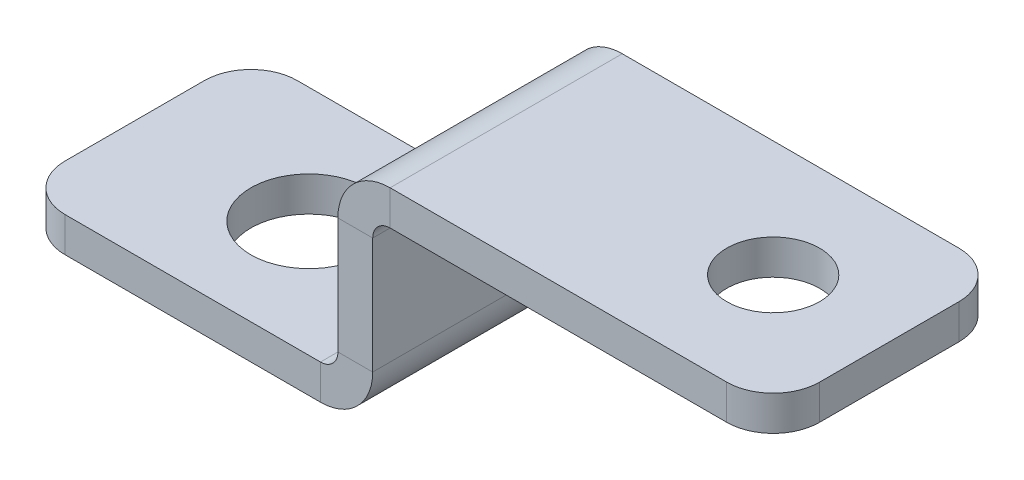
ISO-10303-21;
HEADER;
FILE_DESCRIPTION(('STEP AP214'),'2;1');
FILE_NAME('part.step','',(''),(''),'','','');
FILE_SCHEMA(('AUTOMOTIVE_DESIGN { 1 0 10303 214 1 1 1 1 }'));
ENDSEC;
DATA;
#1=APPLICATION_CONTEXT('core data for automotive mechanical design processes');
#2=APPLICATION_PROTOCOL_DEFINITION('international standard','automotive_design',2000,#1);
#3=PRODUCT_CONTEXT('',#1,'mechanical');
#4=PRODUCT('Part','Part','',(#3));
#5=PRODUCT_RELATED_PRODUCT_CATEGORY('part','',(#4));
#6=PRODUCT_DEFINITION_FORMATION('','',#4);
#7=PRODUCT_DEFINITION_CONTEXT('part definition',#1,'design');
#8=PRODUCT_DEFINITION('design','',#6,#7);
#9=PRODUCT_DEFINITION_SHAPE('','',#8);
#10=(LENGTH_UNIT() NAMED_UNIT(*) SI_UNIT(.MILLI.,.METRE.));
#11=(NAMED_UNIT(*) PLANE_ANGLE_UNIT() SI_UNIT($,.RADIAN.));
#12=(NAMED_UNIT(*) SI_UNIT($,.STERADIAN.) SOLID_ANGLE_UNIT());
#13=UNCERTAINTY_MEASURE_WITH_UNIT(LENGTH_MEASURE(1.E-05),#10,'distance_accuracy_value','');
#14=(GEOMETRIC_REPRESENTATION_CONTEXT(3) GLOBAL_UNCERTAINTY_ASSIGNED_CONTEXT((#13)) GLOBAL_UNIT_ASSIGNED_CONTEXT((#10,
#11,#12)) REPRESENTATION_CONTEXT('',''));
#15=CARTESIAN_POINT('',(0.,0.,0.));
#16=DIRECTION('',(0.,0.,1.));
#17=DIRECTION('',(1.,0.,0.));
#18=AXIS2_PLACEMENT_3D('',#15,#16,#17);
#19=CARTESIAN_POINT('',(13.75,0.75,10.));
#20=DIRECTION('',(0.,0.,1.));
#21=DIRECTION('',(1.,0.,0.));
#22=AXIS2_PLACEMENT_3D('',#19,#20,#21);
#23=PLANE('',#22);
#24=DIRECTION('',(1.,0.,0.));
#25=VECTOR('',#24,1.);
#26=CARTESIAN_POINT('',(13.75,0.75,10.));
#27=LINE('',#26,#25);
#28=CARTESIAN_POINT('',(13.75,0.75,10.));
#29=VERTEX_POINT('',#28);
#30=CARTESIAN_POINT('',(15.25,0.75,10.));
#31=VERTEX_POINT('',#30);
#32=EDGE_CURVE('E318',#29,#31,#27,.T.);
#33=ORIENTED_EDGE('',*,*,#32,.F.);
#34=CARTESIAN_POINT('',(13.,0.75,10.));
#35=DIRECTION('',(0.,0.,-1.));
#36=DIRECTION('',(-1.,0.,0.));
#37=AXIS2_PLACEMENT_3D('',#34,#35,#36);
#38=CIRCLE('',#37,0.75);
#39=CARTESIAN_POINT('',(13.,0.,10.));
#40=VERTEX_POINT('',#39);
#41=EDGE_CURVE('E203',#40,#29,#38,.F.);
#42=ORIENTED_EDGE('',*,*,#41,.F.);
#43=DIRECTION('',(0.,1.,0.));
#44=VECTOR('',#43,1.);
#45=CARTESIAN_POINT('',(13.,-1.5,10.));
#46=LINE('',#45,#44);
#47=CARTESIAN_POINT('',(13.,-1.5,10.));
#48=VERTEX_POINT('',#47);
#49=EDGE_CURVE('E314',#48,#40,#46,.T.);
#50=ORIENTED_EDGE('',*,*,#49,.F.);
#51=CARTESIAN_POINT('',(13.,0.75,10.));
#52=DIRECTION('',(0.,0.,1.));
#53=DIRECTION('',(1.,0.,0.));
#54=AXIS2_PLACEMENT_3D('',#51,#52,#53);
#55=CIRCLE('',#54,2.25);
#56=EDGE_CURVE('E216',#48,#31,#55,.T.);
#57=ORIENTED_EDGE('',*,*,#56,.T.);
#58=EDGE_LOOP('',(#33,#42,#50,#57));
#59=FACE_BOUND('',#58,.T.);
#60=ADVANCED_FACE('F41',(#59),#23,.T.);
#61=CARTESIAN_POINT('',(13.,-1.5,10.));
#62=DIRECTION('',(0.,0.,1.));
#63=DIRECTION('',(1.,0.,0.));
#64=AXIS2_PLACEMENT_3D('',#61,#62,#63);
#65=PLANE('',#64);
#66=DIRECTION('',(0.,1.,0.));
#67=VECTOR('',#66,1.);
#68=CARTESIAN_POINT('',(13.75,0.,10.));
#69=LINE('',#68,#67);
#70=CARTESIAN_POINT('',(13.75,5.75,10.));
#71=VERTEX_POINT('',#70);
#72=EDGE_CURVE('E200',#29,#71,#69,.T.);
#73=ORIENTED_EDGE('',*,*,#72,.F.);
#74=ORIENTED_EDGE('',*,*,#32,.T.);
#75=DIRECTION('',(0.,1.,0.));
#76=VECTOR('',#75,1.);
#77=CARTESIAN_POINT('',(15.25,0.,10.));
#78=LINE('',#77,#76);
#79=CARTESIAN_POINT('',(15.25,5.75,10.));
#80=VERTEX_POINT('',#79);
#81=EDGE_CURVE('E220',#31,#80,#78,.T.);
#82=ORIENTED_EDGE('',*,*,#81,.T.);
#83=DIRECTION('',(-1.,0.,0.));
#84=VECTOR('',#83,1.);
#85=CARTESIAN_POINT('',(15.25,5.75,10.));
#86=LINE('',#85,#84);
#87=EDGE_CURVE('E170',#80,#71,#86,.T.);
#88=ORIENTED_EDGE('',*,*,#87,.T.);
#89=EDGE_LOOP('',(#73,#74,#82,#88));
#90=FACE_BOUND('',#89,.T.);
#91=ADVANCED_FACE('F400',(#90),#65,.T.);
#92=CARTESIAN_POINT('',(13.,0.,0.));
#93=DIRECTION('',(0.,0.,-1.));
#94=DIRECTION('',(-1.,0.,0.));
#95=AXIS2_PLACEMENT_3D('',#92,#93,#94);
#96=PLANE('',#95);
#97=DIRECTION('',(0.,-1.,0.));
#98=VECTOR('',#97,1.);
#99=CARTESIAN_POINT('',(13.,0.,0.));
#100=LINE('',#99,#98);
#101=CARTESIAN_POINT('',(13.,0.,0.));
#102=VERTEX_POINT('',#101);
#103=CARTESIAN_POINT('',(13.,-1.5,0.));
#104=VERTEX_POINT('',#103);
#105=EDGE_CURVE('E310',#102,#104,#100,.T.);
#106=ORIENTED_EDGE('',*,*,#105,.F.);
#107=CARTESIAN_POINT('',(13.,0.75,0.));
#108=DIRECTION('',(0.,0.,-1.));
#109=DIRECTION('',(-1.,0.,0.));
#110=AXIS2_PLACEMENT_3D('',#107,#108,#109);
#111=CIRCLE('',#110,0.75);
#112=CARTESIAN_POINT('',(13.75,0.75,0.));
#113=VERTEX_POINT('',#112);
#114=EDGE_CURVE('E241',#102,#113,#111,.F.);
#115=ORIENTED_EDGE('',*,*,#114,.T.);
#116=DIRECTION('',(-1.,0.,0.));
#117=VECTOR('',#116,1.);
#118=CARTESIAN_POINT('',(15.25,0.75,0.));
#119=LINE('',#118,#117);
#120=CARTESIAN_POINT('',(15.25,0.75,0.));
#121=VERTEX_POINT('',#120);
#122=EDGE_CURVE('E169',#121,#113,#119,.T.);
#123=ORIENTED_EDGE('',*,*,#122,.F.);
#124=CARTESIAN_POINT('',(13.,0.75,0.));
#125=DIRECTION('',(0.,0.,1.));
#126=DIRECTION('',(1.,0.,0.));
#127=AXIS2_PLACEMENT_3D('',#124,#125,#126);
#128=CIRCLE('',#127,2.25);
#129=EDGE_CURVE('E251',#104,#121,#128,.T.);
#130=ORIENTED_EDGE('',*,*,#129,.F.);
#131=EDGE_LOOP('',(#106,#115,#123,#130));
#132=FACE_BOUND('',#131,.T.);
#133=ADVANCED_FACE('F450',(#132),#96,.T.);
#134=CARTESIAN_POINT('',(15.25,0.75,0.));
#135=DIRECTION('',(0.,0.,-1.));
#136=DIRECTION('',(-1.,0.,0.));
#137=AXIS2_PLACEMENT_3D('',#134,#135,#136);
#138=PLANE('',#137);
#139=DIRECTION('',(1.,0.,0.));
#140=VECTOR('',#139,1.);
#141=CARTESIAN_POINT('',(0.,-1.5,0.));
#142=LINE('',#141,#140);
#143=CARTESIAN_POINT('',(2.,-1.5,0.));
#144=VERTEX_POINT('',#143);
#145=EDGE_CURVE('E248',#144,#104,#142,.T.);
#146=ORIENTED_EDGE('',*,*,#145,.F.);
#147=DIRECTION('',(0.,1.,0.));
#148=VECTOR('',#147,1.);
#149=CARTESIAN_POINT('',(2.,0.75,0.));
#150=LINE('',#149,#148);
#151=CARTESIAN_POINT('',(2.,0.,0.));
#152=VERTEX_POINT('',#151);
#153=EDGE_CURVE('E346',#144,#152,#150,.T.);
#154=ORIENTED_EDGE('',*,*,#153,.T.);
#155=DIRECTION('',(1.,0.,0.));
#156=VECTOR('',#155,1.);
#157=CARTESIAN_POINT('',(0.,0.,0.));
#158=LINE('',#157,#156);
#159=EDGE_CURVE('E245',#152,#102,#158,.T.);
#160=ORIENTED_EDGE('',*,*,#159,.T.);
#161=ORIENTED_EDGE('',*,*,#105,.T.);
#162=EDGE_LOOP('',(#146,#154,#160,#161));
#163=FACE_BOUND('',#162,.T.);
#164=ADVANCED_FACE('F373',(#163),#138,.T.);
#165=CARTESIAN_POINT('',(16.,8.,10.));
#166=DIRECTION('',(0.,0.,1.));
#167=DIRECTION('',(1.,0.,0.));
#168=AXIS2_PLACEMENT_3D('',#165,#166,#167);
#169=PLANE('',#168);
#170=DIRECTION('',(0.,-1.,0.));
#171=VECTOR('',#170,1.);
#172=CARTESIAN_POINT('',(16.,8.,10.));
#173=LINE('',#172,#171);
#174=CARTESIAN_POINT('',(16.,8.,10.));
#175=VERTEX_POINT('',#174);
#176=CARTESIAN_POINT('',(16.,6.5,10.));
#177=VERTEX_POINT('',#176);
#178=EDGE_CURVE('E156',#175,#177,#173,.T.);
#179=ORIENTED_EDGE('',*,*,#178,.F.);
#180=CARTESIAN_POINT('',(16.,5.75,10.));
#181=DIRECTION('',(0.,0.,1.));
#182=DIRECTION('',(1.,0.,0.));
#183=AXIS2_PLACEMENT_3D('',#180,#181,#182);
#184=CIRCLE('',#183,2.25);
#185=EDGE_CURVE('E160',#71,#175,#184,.F.);
#186=ORIENTED_EDGE('',*,*,#185,.F.);
#187=ORIENTED_EDGE('',*,*,#87,.F.);
#188=CARTESIAN_POINT('',(16.,5.75,10.));
#189=DIRECTION('',(0.,0.,1.));
#190=DIRECTION('',(1.,0.,0.));
#191=AXIS2_PLACEMENT_3D('',#188,#189,#190);
#192=CIRCLE('',#191,0.75);
#193=EDGE_CURVE('E163',#80,#177,#192,.F.);
#194=ORIENTED_EDGE('',*,*,#193,.T.);
#195=EDGE_LOOP('',(#179,#186,#187,#194));
#196=FACE_BOUND('',#195,.T.);
#197=ADVANCED_FACE('F158',(#196),#169,.T.);
#198=CARTESIAN_POINT('',(15.25,5.75,10.));
#199=DIRECTION('',(0.,0.,1.));
#200=DIRECTION('',(1.,0.,0.));
#201=AXIS2_PLACEMENT_3D('',#198,#199,#200);
#202=PLANE('',#201);
#203=DIRECTION('',(1.,0.,0.));
#204=VECTOR('',#203,1.);
#205=CARTESIAN_POINT('',(13.75,6.5,10.));
#206=LINE('',#205,#204);
#207=CARTESIAN_POINT('',(30.5,6.5,10.));
#208=VERTEX_POINT('',#207);
#209=EDGE_CURVE('E194',#177,#208,#206,.T.);
#210=ORIENTED_EDGE('',*,*,#209,.T.);
#211=DIRECTION('',(0.,-1.,0.));
#212=VECTOR('',#211,1.);
#213=CARTESIAN_POINT('',(30.5,5.75,10.));
#214=LINE('',#213,#212);
#215=CARTESIAN_POINT('',(30.5,8.,10.));
#216=VERTEX_POINT('',#215);
#217=EDGE_CURVE('E192',#208,#216,#214,.F.);
#218=ORIENTED_EDGE('',*,*,#217,.T.);
#219=DIRECTION('',(1.,0.,0.));
#220=VECTOR('',#219,1.);
#221=CARTESIAN_POINT('',(13.75,8.,10.));
#222=LINE('',#221,#220);
#223=EDGE_CURVE('E179',#175,#216,#222,.T.);
#224=ORIENTED_EDGE('',*,*,#223,.F.);
#225=ORIENTED_EDGE('',*,*,#178,.T.);
#226=EDGE_LOOP('',(#210,#218,#224,#225));
#227=FACE_BOUND('',#226,.T.);
#228=ADVANCED_FACE('F190',(#227),#202,.T.);
#229=CARTESIAN_POINT('',(13.75,5.75,0.));
#230=DIRECTION('',(0.,0.,-1.));
#231=DIRECTION('',(-1.,0.,0.));
#232=AXIS2_PLACEMENT_3D('',#229,#230,#231);
#233=PLANE('',#232);
#234=DIRECTION('',(1.,0.,0.));
#235=VECTOR('',#234,1.);
#236=CARTESIAN_POINT('',(13.75,5.75,0.));
#237=LINE('',#236,#235);
#238=CARTESIAN_POINT('',(13.75,5.75,0.));
#239=VERTEX_POINT('',#238);
#240=CARTESIAN_POINT('',(15.25,5.75,0.));
#241=VERTEX_POINT('',#240);
#242=EDGE_CURVE('E303',#239,#241,#237,.T.);
#243=ORIENTED_EDGE('',*,*,#242,.F.);
#244=CARTESIAN_POINT('',(16.,5.75,0.));
#245=DIRECTION('',(0.,0.,1.));
#246=DIRECTION('',(1.,0.,0.));
#247=AXIS2_PLACEMENT_3D('',#244,#245,#246);
#248=CIRCLE('',#247,2.25);
#249=CARTESIAN_POINT('',(16.,8.,0.));
#250=VERTEX_POINT('',#249);
#251=EDGE_CURVE('E234',#239,#250,#248,.F.);
#252=ORIENTED_EDGE('',*,*,#251,.T.);
#253=DIRECTION('',(0.,1.,0.));
#254=VECTOR('',#253,1.);
#255=CARTESIAN_POINT('',(16.,6.5,0.));
#256=LINE('',#255,#254);
#257=CARTESIAN_POINT('',(16.,6.5,0.));
#258=VERTEX_POINT('',#257);
#259=EDGE_CURVE('E300',#258,#250,#256,.T.);
#260=ORIENTED_EDGE('',*,*,#259,.F.);
#261=CARTESIAN_POINT('',(16.,5.75,0.));
#262=DIRECTION('',(0.,0.,1.));
#263=DIRECTION('',(1.,0.,0.));
#264=AXIS2_PLACEMENT_3D('',#261,#262,#263);
#265=CIRCLE('',#264,0.75);
#266=EDGE_CURVE('E259',#241,#258,#265,.F.);
#267=ORIENTED_EDGE('',*,*,#266,.F.);
#268=EDGE_LOOP('',(#243,#252,#260,#267));
#269=FACE_BOUND('',#268,.T.);
#270=ADVANCED_FACE('F579',(#269),#233,.T.);
#271=CARTESIAN_POINT('',(16.,6.5,0.));
#272=DIRECTION('',(0.,0.,-1.));
#273=DIRECTION('',(-1.,0.,0.));
#274=AXIS2_PLACEMENT_3D('',#271,#272,#273);
#275=PLANE('',#274);
#276=DIRECTION('',(0.,1.,0.));
#277=VECTOR('',#276,1.);
#278=CARTESIAN_POINT('',(13.75,0.,0.));
#279=LINE('',#278,#277);
#280=EDGE_CURVE('E237',#113,#239,#279,.T.);
#281=ORIENTED_EDGE('',*,*,#280,.T.);
#282=ORIENTED_EDGE('',*,*,#242,.T.);
#283=DIRECTION('',(0.,1.,0.));
#284=VECTOR('',#283,1.);
#285=CARTESIAN_POINT('',(15.25,0.,0.));
#286=LINE('',#285,#284);
#287=EDGE_CURVE('E255',#121,#241,#286,.T.);
#288=ORIENTED_EDGE('',*,*,#287,.F.);
#289=ORIENTED_EDGE('',*,*,#122,.T.);
#290=EDGE_LOOP('',(#281,#282,#288,#289));
#291=FACE_BOUND('',#290,.T.);
#292=ADVANCED_FACE('F566',(#291),#275,.T.);
#293=CARTESIAN_POINT('',(13.75,6.5,10.));
#294=DIRECTION('',(0.,1.,0.));
#295=DIRECTION('',(0.,0.,1.));
#296=AXIS2_PLACEMENT_3D('',#293,#294,#295);
#297=PLANE('',#296);
#298=CARTESIAN_POINT('',(27.5,6.5,5.));
#299=DIRECTION('',(0.,1.,0.));
#300=DIRECTION('',(0.,0.,1.));
#301=AXIS2_PLACEMENT_3D('',#298,#299,#300);
#302=CIRCLE('',#301,2.);
#303=CARTESIAN_POINT('',(27.5,6.5,7.));
#304=VERTEX_POINT('',#303);
#305=EDGE_CURVE('E420',#304,#304,#302,.T.);
#306=ORIENTED_EDGE('',*,*,#305,.T.);
#307=EDGE_LOOP('',(#306));
#308=FACE_BOUND('',#307,.T.);
#309=DIRECTION('',(1.,0.,0.));
#310=VECTOR('',#309,1.);
#311=CARTESIAN_POINT('',(13.75,6.5,0.));
#312=LINE('',#311,#310);
#313=CARTESIAN_POINT('',(30.5,6.5,0.));
#314=VERTEX_POINT('',#313);
#315=EDGE_CURVE('E227',#258,#314,#312,.T.);
#316=ORIENTED_EDGE('',*,*,#315,.T.);
#317=CARTESIAN_POINT('',(30.5,6.5,2.));
#318=DIRECTION('',(0.,1.,0.));
#319=DIRECTION('',(0.,0.,1.));
#320=AXIS2_PLACEMENT_3D('',#317,#318,#319);
#321=CIRCLE('',#320,2.);
#322=CARTESIAN_POINT('',(32.5,6.5,2.));
#323=VERTEX_POINT('',#322);
#324=EDGE_CURVE('E328',#314,#323,#321,.F.);
#325=ORIENTED_EDGE('',*,*,#324,.T.);
#326=DIRECTION('',(0.,0.,-1.));
#327=VECTOR('',#326,1.);
#328=CARTESIAN_POINT('',(32.5,6.5,10.));
#329=LINE('',#328,#327);
#330=CARTESIAN_POINT('',(32.5,6.5,8.));
#331=VERTEX_POINT('',#330);
#332=EDGE_CURVE('E296',#331,#323,#329,.T.);
#333=ORIENTED_EDGE('',*,*,#332,.F.);
#334=CARTESIAN_POINT('',(30.5,6.5,8.));
#335=DIRECTION('',(0.,1.,0.));
#336=DIRECTION('',(0.,0.,1.));
#337=AXIS2_PLACEMENT_3D('',#334,#335,#336);
#338=CIRCLE('',#337,2.);
#339=EDGE_CURVE('E325',#331,#208,#338,.F.);
#340=ORIENTED_EDGE('',*,*,#339,.T.);
#341=ORIENTED_EDGE('',*,*,#209,.F.);
#342=DIRECTION('',(0.,0.,-1.));
#343=VECTOR('',#342,1.);
#344=CARTESIAN_POINT('',(16.,6.5,10.));
#345=LINE('',#344,#343);
#346=EDGE_CURVE('E226',#177,#258,#345,.T.);
#347=ORIENTED_EDGE('',*,*,#346,.T.);
#348=EDGE_LOOP('',(#316,#325,#333,#340,#341,#347));
#349=FACE_BOUND('',#348,.T.);
#350=ADVANCED_FACE('F412',(#308,#349),#297,.F.);
#351=CARTESIAN_POINT('',(32.5,8.,10.));
#352=DIRECTION('',(1.,0.,0.));
#353=DIRECTION('',(0.,0.,-1.));
#354=AXIS2_PLACEMENT_3D('',#351,#352,#353);
#355=PLANE('',#354);
#356=ORIENTED_EDGE('',*,*,#332,.T.);
#357=DIRECTION('',(0.,-1.,0.));
#358=VECTOR('',#357,1.);
#359=CARTESIAN_POINT('',(32.5,8.,2.));
#360=LINE('',#359,#358);
#361=CARTESIAN_POINT('',(32.5,8.,2.));
#362=VERTEX_POINT('',#361);
#363=EDGE_CURVE('E335',#323,#362,#360,.F.);
#364=ORIENTED_EDGE('',*,*,#363,.T.);
#365=DIRECTION('',(0.,0.,-1.));
#366=VECTOR('',#365,1.);
#367=CARTESIAN_POINT('',(32.5,8.,10.));
#368=LINE('',#367,#366);
#369=CARTESIAN_POINT('',(32.5,8.,8.));
#370=VERTEX_POINT('',#369);
#371=EDGE_CURVE('E187',#370,#362,#368,.T.);
#372=ORIENTED_EDGE('',*,*,#371,.F.);
#373=DIRECTION('',(0.,-1.,0.));
#374=VECTOR('',#373,1.);
#375=CARTESIAN_POINT('',(32.5,8.,8.));
#376=LINE('',#375,#374);
#377=EDGE_CURVE('E331',#370,#331,#376,.T.);
#378=ORIENTED_EDGE('',*,*,#377,.T.);
#379=EDGE_LOOP('',(#356,#364,#372,#378));
#380=FACE_BOUND('',#379,.T.);
#381=ADVANCED_FACE('F436',(#380),#355,.T.);
#382=CARTESIAN_POINT('',(13.75,8.,10.));
#383=DIRECTION('',(0.,1.,0.));
#384=DIRECTION('',(0.,0.,1.));
#385=AXIS2_PLACEMENT_3D('',#382,#383,#384);
#386=PLANE('',#385);
#387=CARTESIAN_POINT('',(27.5,8.,5.));
#388=DIRECTION('',(0.,1.,0.));
#389=DIRECTION('',(0.,0.,1.));
#390=AXIS2_PLACEMENT_3D('',#387,#388,#389);
#391=CIRCLE('',#390,2.);
#392=CARTESIAN_POINT('',(27.5,8.,7.));
#393=VERTEX_POINT('',#392);
#394=EDGE_CURVE('E427',#393,#393,#391,.T.);
#395=ORIENTED_EDGE('',*,*,#394,.F.);
#396=EDGE_LOOP('',(#395));
#397=FACE_BOUND('',#396,.T.);
#398=ORIENTED_EDGE('',*,*,#371,.T.);
#399=CARTESIAN_POINT('',(30.5,8.,2.));
#400=DIRECTION('',(0.,1.,0.));
#401=DIRECTION('',(0.,0.,1.));
#402=AXIS2_PLACEMENT_3D('',#399,#400,#401);
#403=CIRCLE('',#402,2.);
#404=CARTESIAN_POINT('',(30.5,8.,0.));
#405=VERTEX_POINT('',#404);
#406=EDGE_CURVE('E341',#362,#405,#403,.T.);
#407=ORIENTED_EDGE('',*,*,#406,.T.);
#408=DIRECTION('',(1.,0.,0.));
#409=VECTOR('',#408,1.);
#410=CARTESIAN_POINT('',(13.75,8.,0.));
#411=LINE('',#410,#409);
#412=EDGE_CURVE('E182',#250,#405,#411,.T.);
#413=ORIENTED_EDGE('',*,*,#412,.F.);
#414=DIRECTION('',(0.,0.,-1.));
#415=VECTOR('',#414,1.);
#416=CARTESIAN_POINT('',(16.,8.,10.));
#417=LINE('',#416,#415);
#418=EDGE_CURVE('E176',#175,#250,#417,.T.);
#419=ORIENTED_EDGE('',*,*,#418,.F.);
#420=ORIENTED_EDGE('',*,*,#223,.T.);
#421=CARTESIAN_POINT('',(30.5,8.,8.));
#422=DIRECTION('',(0.,1.,0.));
#423=DIRECTION('',(0.,0.,1.));
#424=AXIS2_PLACEMENT_3D('',#421,#422,#423);
#425=CIRCLE('',#424,2.);
#426=EDGE_CURVE('E338',#216,#370,#425,.T.);
#427=ORIENTED_EDGE('',*,*,#426,.T.);
#428=EDGE_LOOP('',(#398,#407,#413,#419,#420,#427));
#429=FACE_BOUND('',#428,.T.);
#430=ADVANCED_FACE('F178',(#397,#429),#386,.T.);
#431=CARTESIAN_POINT('',(16.,5.75,10.));
#432=DIRECTION('',(0.,0.,-1.));
#433=DIRECTION('',(-1.,0.,0.));
#434=AXIS2_PLACEMENT_3D('',#431,#432,#433);
#435=CYLINDRICAL_SURFACE('',#434,2.25);
#436=ORIENTED_EDGE('',*,*,#251,.F.);
#437=DIRECTION('',(0.,0.,-1.));
#438=VECTOR('',#437,1.);
#439=CARTESIAN_POINT('',(13.75,5.75,10.));
#440=LINE('',#439,#438);
#441=EDGE_CURVE('E188',#71,#239,#440,.T.);
#442=ORIENTED_EDGE('',*,*,#441,.F.);
#443=ORIENTED_EDGE('',*,*,#185,.T.);
#444=ORIENTED_EDGE('',*,*,#418,.T.);
#445=EDGE_LOOP('',(#436,#442,#443,#444));
#446=FACE_BOUND('',#445,.T.);
#447=ADVANCED_FACE('F197',(#446),#435,.T.);
#448=CARTESIAN_POINT('',(13.75,0.,10.));
#449=DIRECTION('',(-1.,0.,0.));
#450=DIRECTION('',(0.,0.,1.));
#451=AXIS2_PLACEMENT_3D('',#448,#449,#450);
#452=PLANE('',#451);
#453=ORIENTED_EDGE('',*,*,#280,.F.);
#454=DIRECTION('',(0.,0.,-1.));
#455=VECTOR('',#454,1.);
#456=CARTESIAN_POINT('',(13.75,0.75,10.));
#457=LINE('',#456,#455);
#458=EDGE_CURVE('E288',#29,#113,#457,.T.);
#459=ORIENTED_EDGE('',*,*,#458,.F.);
#460=ORIENTED_EDGE('',*,*,#72,.T.);
#461=ORIENTED_EDGE('',*,*,#441,.T.);
#462=EDGE_LOOP('',(#453,#459,#460,#461));
#463=FACE_BOUND('',#462,.T.);
#464=ADVANCED_FACE('F399',(#463),#452,.T.);
#465=CARTESIAN_POINT('',(13.,0.75,10.));
#466=DIRECTION('',(0.,0.,-1.));
#467=DIRECTION('',(-1.,0.,0.));
#468=AXIS2_PLACEMENT_3D('',#465,#466,#467);
#469=CYLINDRICAL_SURFACE('',#468,0.75);
#470=ORIENTED_EDGE('',*,*,#114,.F.);
#471=DIRECTION('',(0.,0.,-1.));
#472=VECTOR('',#471,1.);
#473=CARTESIAN_POINT('',(13.,0.,10.));
#474=LINE('',#473,#472);
#475=EDGE_CURVE('E284',#40,#102,#474,.T.);
#476=ORIENTED_EDGE('',*,*,#475,.F.);
#477=ORIENTED_EDGE('',*,*,#41,.T.);
#478=ORIENTED_EDGE('',*,*,#458,.T.);
#479=EDGE_LOOP('',(#470,#476,#477,#478));
#480=FACE_BOUND('',#479,.T.);
#481=ADVANCED_FACE('F391',(#480),#469,.F.);
#482=CARTESIAN_POINT('',(0.,0.,10.));
#483=DIRECTION('',(0.,1.,0.));
#484=DIRECTION('',(0.,0.,1.));
#485=AXIS2_PLACEMENT_3D('',#482,#483,#484);
#486=PLANE('',#485);
#487=CARTESIAN_POINT('',(7.5,0.,5.));
#488=DIRECTION('',(0.,1.,0.));
#489=DIRECTION('',(0.,0.,1.));
#490=AXIS2_PLACEMENT_3D('',#487,#488,#489);
#491=CIRCLE('',#490,2.5);
#492=CARTESIAN_POINT('',(7.5,0.,7.5));
#493=VERTEX_POINT('',#492);
#494=EDGE_CURVE('E416',#493,#493,#491,.T.);
#495=ORIENTED_EDGE('',*,*,#494,.F.);
#496=EDGE_LOOP('',(#495));
#497=FACE_BOUND('',#496,.T.);
#498=ORIENTED_EDGE('',*,*,#159,.F.);
#499=CARTESIAN_POINT('',(2.,0.,2.));
#500=DIRECTION('',(0.,1.,0.));
#501=DIRECTION('',(0.,0.,1.));
#502=AXIS2_PLACEMENT_3D('',#499,#500,#501);
#503=CIRCLE('',#502,2.);
#504=CARTESIAN_POINT('',(0.,0.,2.));
#505=VERTEX_POINT('',#504);
#506=EDGE_CURVE('E353',#152,#505,#503,.T.);
#507=ORIENTED_EDGE('',*,*,#506,.T.);
#508=DIRECTION('',(0.,0.,-1.));
#509=VECTOR('',#508,1.);
#510=CARTESIAN_POINT('',(0.,0.,10.));
#511=LINE('',#510,#509);
#512=CARTESIAN_POINT('',(0.,0.,8.));
#513=VERTEX_POINT('',#512);
#514=EDGE_CURVE('E281',#513,#505,#511,.T.);
#515=ORIENTED_EDGE('',*,*,#514,.F.);
#516=CARTESIAN_POINT('',(2.,0.,8.));
#517=DIRECTION('',(0.,1.,0.));
#518=DIRECTION('',(0.,0.,1.));
#519=AXIS2_PLACEMENT_3D('',#516,#517,#518);
#520=CIRCLE('',#519,2.);
#521=CARTESIAN_POINT('',(2.,0.,10.));
#522=VERTEX_POINT('',#521);
#523=EDGE_CURVE('E350',#513,#522,#520,.T.);
#524=ORIENTED_EDGE('',*,*,#523,.T.);
#525=DIRECTION('',(1.,0.,0.));
#526=VECTOR('',#525,1.);
#527=CARTESIAN_POINT('',(0.,0.,10.));
#528=LINE('',#527,#526);
#529=EDGE_CURVE('E210',#522,#40,#528,.T.);
#530=ORIENTED_EDGE('',*,*,#529,.T.);
#531=ORIENTED_EDGE('',*,*,#475,.T.);
#532=EDGE_LOOP('',(#498,#507,#515,#524,#530,#531));
#533=FACE_BOUND('',#532,.T.);
#534=ADVANCED_FACE('F379',(#497,#533),#486,.T.);
#535=CARTESIAN_POINT('',(0.,-1.5,10.));
#536=DIRECTION('',(-1.,0.,0.));
#537=DIRECTION('',(0.,0.,1.));
#538=AXIS2_PLACEMENT_3D('',#535,#536,#537);
#539=PLANE('',#538);
#540=ORIENTED_EDGE('',*,*,#514,.T.);
#541=DIRECTION('',(0.,1.,0.));
#542=VECTOR('',#541,1.);
#543=CARTESIAN_POINT('',(0.,-1.5,2.));
#544=LINE('',#543,#542);
#545=CARTESIAN_POINT('',(0.,-1.5,2.));
#546=VERTEX_POINT('',#545);
#547=EDGE_CURVE('E63',#505,#546,#544,.F.);
#548=ORIENTED_EDGE('',*,*,#547,.T.);
#549=DIRECTION('',(0.,0.,-1.));
#550=VECTOR('',#549,1.);
#551=CARTESIAN_POINT('',(0.,-1.5,10.));
#552=LINE('',#551,#550);
#553=CARTESIAN_POINT('',(0.,-1.5,8.));
#554=VERTEX_POINT('',#553);
#555=EDGE_CURVE('E278',#554,#546,#552,.T.);
#556=ORIENTED_EDGE('',*,*,#555,.F.);
#557=DIRECTION('',(0.,1.,0.));
#558=VECTOR('',#557,1.);
#559=CARTESIAN_POINT('',(0.,-1.5,8.));
#560=LINE('',#559,#558);
#561=EDGE_CURVE('E356',#554,#513,#560,.T.);
#562=ORIENTED_EDGE('',*,*,#561,.T.);
#563=EDGE_LOOP('',(#540,#548,#556,#562));
#564=FACE_BOUND('',#563,.T.);
#565=ADVANCED_FACE('F380',(#564),#539,.T.);
#566=CARTESIAN_POINT('',(0.,-1.5,10.));
#567=DIRECTION('',(0.,1.,0.));
#568=DIRECTION('',(0.,0.,1.));
#569=AXIS2_PLACEMENT_3D('',#566,#567,#568);
#570=PLANE('',#569);
#571=CARTESIAN_POINT('',(7.5,-1.5,5.));
#572=DIRECTION('',(0.,1.,0.));
#573=DIRECTION('',(0.,0.,1.));
#574=AXIS2_PLACEMENT_3D('',#571,#572,#573);
#575=CIRCLE('',#574,2.5);
#576=CARTESIAN_POINT('',(7.5,-1.5,7.5));
#577=VERTEX_POINT('',#576);
#578=EDGE_CURVE('E231',#577,#577,#575,.T.);
#579=ORIENTED_EDGE('',*,*,#578,.T.);
#580=EDGE_LOOP('',(#579));
#581=FACE_BOUND('',#580,.T.);
#582=ORIENTED_EDGE('',*,*,#555,.T.);
#583=CARTESIAN_POINT('',(2.,-1.5,2.));
#584=DIRECTION('',(0.,1.,0.));
#585=DIRECTION('',(0.,0.,1.));
#586=AXIS2_PLACEMENT_3D('',#583,#584,#585);
#587=CIRCLE('',#586,2.);
#588=EDGE_CURVE('E50',#546,#144,#587,.F.);
#589=ORIENTED_EDGE('',*,*,#588,.T.);
#590=ORIENTED_EDGE('',*,*,#145,.T.);
#591=DIRECTION('',(0.,0.,-1.));
#592=VECTOR('',#591,1.);
#593=CARTESIAN_POINT('',(13.,-1.5,10.));
#594=LINE('',#593,#592);
#595=EDGE_CURVE('E274',#48,#104,#594,.T.);
#596=ORIENTED_EDGE('',*,*,#595,.F.);
#597=DIRECTION('',(1.,0.,0.));
#598=VECTOR('',#597,1.);
#599=CARTESIAN_POINT('',(0.,-1.5,10.));
#600=LINE('',#599,#598);
#601=CARTESIAN_POINT('',(2.,-1.5,10.));
#602=VERTEX_POINT('',#601);
#603=EDGE_CURVE('E213',#602,#48,#600,.T.);
#604=ORIENTED_EDGE('',*,*,#603,.F.);
#605=CARTESIAN_POINT('',(2.,-1.5,8.));
#606=DIRECTION('',(0.,1.,0.));
#607=DIRECTION('',(0.,0.,1.));
#608=AXIS2_PLACEMENT_3D('',#605,#606,#607);
#609=CIRCLE('',#608,2.);
#610=EDGE_CURVE('E362',#602,#554,#609,.F.);
#611=ORIENTED_EDGE('',*,*,#610,.T.);
#612=EDGE_LOOP('',(#582,#589,#590,#596,#604,#611));
#613=FACE_BOUND('',#612,.T.);
#614=ADVANCED_FACE('F368',(#581,#613),#570,.F.);
#615=CARTESIAN_POINT('',(13.,0.75,10.));
#616=DIRECTION('',(0.,0.,-1.));
#617=DIRECTION('',(-1.,0.,0.));
#618=AXIS2_PLACEMENT_3D('',#615,#616,#617);
#619=CYLINDRICAL_SURFACE('',#618,2.25);
#620=ORIENTED_EDGE('',*,*,#129,.T.);
#621=DIRECTION('',(0.,0.,-1.));
#622=VECTOR('',#621,1.);
#623=CARTESIAN_POINT('',(15.25,0.75,10.));
#624=LINE('',#623,#622);
#625=EDGE_CURVE('E270',#31,#121,#624,.T.);
#626=ORIENTED_EDGE('',*,*,#625,.F.);
#627=ORIENTED_EDGE('',*,*,#56,.F.);
#628=ORIENTED_EDGE('',*,*,#595,.T.);
#629=EDGE_LOOP('',(#620,#626,#627,#628));
#630=FACE_BOUND('',#629,.T.);
#631=ADVANCED_FACE('F519',(#630),#619,.T.);
#632=CARTESIAN_POINT('',(15.25,0.,10.));
#633=DIRECTION('',(-1.,0.,0.));
#634=DIRECTION('',(0.,0.,1.));
#635=AXIS2_PLACEMENT_3D('',#632,#633,#634);
#636=PLANE('',#635);
#637=ORIENTED_EDGE('',*,*,#287,.T.);
#638=DIRECTION('',(0.,0.,-1.));
#639=VECTOR('',#638,1.);
#640=CARTESIAN_POINT('',(15.25,5.75,10.));
#641=LINE('',#640,#639);
#642=EDGE_CURVE('E266',#80,#241,#641,.T.);
#643=ORIENTED_EDGE('',*,*,#642,.F.);
#644=ORIENTED_EDGE('',*,*,#81,.F.);
#645=ORIENTED_EDGE('',*,*,#625,.T.);
#646=EDGE_LOOP('',(#637,#643,#644,#645));
#647=FACE_BOUND('',#646,.T.);
#648=ADVANCED_FACE('F404',(#647),#636,.F.);
#649=CARTESIAN_POINT('',(16.,5.75,10.));
#650=DIRECTION('',(0.,0.,-1.));
#651=DIRECTION('',(-1.,0.,0.));
#652=AXIS2_PLACEMENT_3D('',#649,#650,#651);
#653=CYLINDRICAL_SURFACE('',#652,0.75);
#654=ORIENTED_EDGE('',*,*,#266,.T.);
#655=ORIENTED_EDGE('',*,*,#346,.F.);
#656=ORIENTED_EDGE('',*,*,#193,.F.);
#657=ORIENTED_EDGE('',*,*,#642,.T.);
#658=EDGE_LOOP('',(#654,#655,#656,#657));
#659=FACE_BOUND('',#658,.T.);
#660=ADVANCED_FACE('F408',(#659),#653,.F.);
#661=CARTESIAN_POINT('',(16.,5.75,10.));
#662=DIRECTION('',(0.,0.,1.));
#663=DIRECTION('',(1.,0.,0.));
#664=AXIS2_PLACEMENT_3D('',#661,#662,#663);
#665=PLANE('',#664);
#666=ORIENTED_EDGE('',*,*,#529,.F.);
#667=DIRECTION('',(0.,1.,0.));
#668=VECTOR('',#667,1.);
#669=CARTESIAN_POINT('',(2.,5.75,10.));
#670=LINE('',#669,#668);
#671=EDGE_CURVE('E11',#522,#602,#670,.F.);
#672=ORIENTED_EDGE('',*,*,#671,.T.);
#673=ORIENTED_EDGE('',*,*,#603,.T.);
#674=ORIENTED_EDGE('',*,*,#49,.T.);
#675=EDGE_LOOP('',(#666,#672,#673,#674));
#676=FACE_BOUND('',#675,.T.);
#677=ADVANCED_FACE('F384',(#676),#665,.T.);
#678=CARTESIAN_POINT('',(16.,5.75,0.));
#679=DIRECTION('',(0.,0.,1.));
#680=DIRECTION('',(1.,0.,0.));
#681=AXIS2_PLACEMENT_3D('',#678,#679,#680);
#682=PLANE('',#681);
#683=ORIENTED_EDGE('',*,*,#412,.T.);
#684=DIRECTION('',(0.,-1.,0.));
#685=VECTOR('',#684,1.);
#686=CARTESIAN_POINT('',(30.5,6.5,0.));
#687=LINE('',#686,#685);
#688=EDGE_CURVE('E321',#405,#314,#687,.T.);
#689=ORIENTED_EDGE('',*,*,#688,.T.);
#690=ORIENTED_EDGE('',*,*,#315,.F.);
#691=ORIENTED_EDGE('',*,*,#259,.T.);
#692=EDGE_LOOP('',(#683,#689,#690,#691));
#693=FACE_BOUND('',#692,.T.);
#694=ADVANCED_FACE('F490',(#693),#682,.F.);
#695=CARTESIAN_POINT('',(7.5,-1.5,5.));
#696=DIRECTION('',(0.,1.,0.));
#697=DIRECTION('',(0.,0.,1.));
#698=AXIS2_PLACEMENT_3D('',#695,#696,#697);
#699=CYLINDRICAL_SURFACE('',#698,2.5);
#700=CARTESIAN_POINT('',(7.5,-1.5,7.5));
#701=CARTESIAN_POINT('',(7.5,-1.484375,7.5));
#702=CARTESIAN_POINT('',(7.5,-1.46875,7.5));
#703=CARTESIAN_POINT('',(7.5,-1.4375,7.5));
#704=CARTESIAN_POINT('',(7.5,-1.421875,7.5));
#705=CARTESIAN_POINT('',(7.5,-1.390625,7.5));
#706=CARTESIAN_POINT('',(7.5,-1.375,7.5));
#707=CARTESIAN_POINT('',(7.5,-1.34375,7.5));
#708=CARTESIAN_POINT('',(7.5,-1.328125,7.5));
#709=CARTESIAN_POINT('',(7.5,-1.296875,7.5));
#710=CARTESIAN_POINT('',(7.5,-1.28125,7.5));
#711=CARTESIAN_POINT('',(7.5,-1.25,7.5));
#712=CARTESIAN_POINT('',(7.5,-1.234375,7.5));
#713=CARTESIAN_POINT('',(7.5,-1.203125,7.5));
#714=CARTESIAN_POINT('',(7.5,-1.1875,7.5));
#715=CARTESIAN_POINT('',(7.5,-1.15625,7.5));
#716=CARTESIAN_POINT('',(7.5,-1.140625,7.5));
#717=CARTESIAN_POINT('',(7.5,-1.109375,7.5));
#718=CARTESIAN_POINT('',(7.5,-1.09375,7.5));
#719=CARTESIAN_POINT('',(7.5,-1.0625,7.5));
#720=CARTESIAN_POINT('',(7.5,-1.046875,7.5));
#721=CARTESIAN_POINT('',(7.5,-1.015625,7.5));
#722=CARTESIAN_POINT('',(7.5,-1.,7.5));
#723=CARTESIAN_POINT('',(7.5,-0.96875,7.5));
#724=CARTESIAN_POINT('',(7.5,-0.953125,7.5));
#725=CARTESIAN_POINT('',(7.5,-0.921875,7.5));
#726=CARTESIAN_POINT('',(7.5,-0.90625,7.5));
#727=CARTESIAN_POINT('',(7.5,-0.875,7.5));
#728=CARTESIAN_POINT('',(7.5,-0.859375,7.5));
#729=CARTESIAN_POINT('',(7.5,-0.828125,7.5));
#730=CARTESIAN_POINT('',(7.5,-0.8125,7.5));
#731=CARTESIAN_POINT('',(7.5,-0.78125,7.5));
#732=CARTESIAN_POINT('',(7.5,-0.765625,7.5));
#733=CARTESIAN_POINT('',(7.5,-0.734375,7.5));
#734=CARTESIAN_POINT('',(7.5,-0.71875,7.5));
#735=CARTESIAN_POINT('',(7.5,-0.6875,7.5));
#736=CARTESIAN_POINT('',(7.5,-0.671875,7.5));
#737=CARTESIAN_POINT('',(7.5,-0.640625,7.5));
#738=CARTESIAN_POINT('',(7.5,-0.625,7.5));
#739=CARTESIAN_POINT('',(7.5,-0.59375,7.5));
#740=CARTESIAN_POINT('',(7.5,-0.578125,7.5));
#741=CARTESIAN_POINT('',(7.5,-0.546875,7.5));
#742=CARTESIAN_POINT('',(7.5,-0.53125,7.5));
#743=CARTESIAN_POINT('',(7.5,-0.5,7.5));
#744=CARTESIAN_POINT('',(7.5,-0.484375,7.5));
#745=CARTESIAN_POINT('',(7.5,-0.453125,7.5));
#746=CARTESIAN_POINT('',(7.5,-0.4375,7.5));
#747=CARTESIAN_POINT('',(7.5,-0.40625,7.5));
#748=CARTESIAN_POINT('',(7.5,-0.390625,7.5));
#749=CARTESIAN_POINT('',(7.5,-0.359375,7.5));
#750=CARTESIAN_POINT('',(7.5,-0.34375,7.5));
#751=CARTESIAN_POINT('',(7.5,-0.3125,7.5));
#752=CARTESIAN_POINT('',(7.5,-0.296875,7.5));
#753=CARTESIAN_POINT('',(7.5,-0.265625,7.5));
#754=CARTESIAN_POINT('',(7.5,-0.25,7.5));
#755=CARTESIAN_POINT('',(7.5,-0.21875,7.5));
#756=CARTESIAN_POINT('',(7.5,-0.203125,7.5));
#757=CARTESIAN_POINT('',(7.5,-0.171875,7.5));
#758=CARTESIAN_POINT('',(7.5,-0.15625,7.5));
#759=CARTESIAN_POINT('',(7.5,-0.125,7.5));
#760=CARTESIAN_POINT('',(7.5,-0.109375,7.5));
#761=CARTESIAN_POINT('',(7.5,-0.0781250000000001,7.5));
#762=CARTESIAN_POINT('',(7.5,-0.0625000000000001,7.5));
#763=CARTESIAN_POINT('',(7.5,-0.03125,7.5));
#764=CARTESIAN_POINT('',(7.5,-0.015625,7.5));
#765=CARTESIAN_POINT('',(7.5,0.,7.5));
#766=B_SPLINE_CURVE_WITH_KNOTS('',3,(#700,#701,#702,#703,#704,#705,#706,#707,#708,#709,#710,
#711,#712,#713,#714,#715,#716,#717,#718,#719,#720,#721,#722,#723,#724,#725,#726,#727,#728,#729,
#730,#731,#732,#733,#734,#735,#736,#737,#738,#739,#740,#741,#742,#743,#744,#745,#746,#747,#748,
#749,#750,#751,#752,#753,#754,#755,#756,#757,#758,#759,#760,#761,#762,#763,#764,#765),
.UNSPECIFIED.,.F.,.F.,(4,2,2,2,2,2,2,2,2,2,2,2,2,2,2,2,2,2,2,2,2,2,2,2,2,2,2,2,2,2,2,2,4),(0.,
0.0468749999999998,0.0937499999999999,0.140625,0.1875,0.234375,0.28125,0.328125,0.375,0.421875,
0.46875,0.515625,0.5625,0.609375,0.65625,0.703125,0.75,0.796875,0.84375,0.890625,0.9375,
0.984375,1.03125,1.078125,1.125,1.171875,1.21875,1.265625,1.3125,1.359375,1.40625,1.453125,1.5),.UNSPECIFIED.);
#767=EDGE_CURVE('BSEAM495',#577,#493,#766,.T.);
#768=ORIENTED_EDGE('',*,*,#578,.F.);
#769=ORIENTED_EDGE('',*,*,#494,.T.);
#770=ORIENTED_EDGE('',*,*,#767,.T.);
#771=ORIENTED_EDGE('',*,*,#767,.F.);
#772=EDGE_LOOP('',(#768,#770,#769,#771));
#773=FACE_BOUND('',#772,.T.);
#774=ADVANCED_FACE('F495',(#773),#699,.F.);
#775=CARTESIAN_POINT('',(27.5,-1.5,5.));
#776=DIRECTION('',(0.,1.,0.));
#777=DIRECTION('',(0.,0.,1.));
#778=AXIS2_PLACEMENT_3D('',#775,#776,#777);
#779=CYLINDRICAL_SURFACE('',#778,2.);
#780=ORIENTED_EDGE('',*,*,#394,.T.);
#781=EDGE_LOOP('',(#780));
#782=FACE_BOUND('',#781,.T.);
#783=ORIENTED_EDGE('',*,*,#305,.F.);
#784=EDGE_LOOP('',(#783));
#785=FACE_BOUND('',#784,.T.);
#786=ADVANCED_FACE('F432',(#782,#785),#779,.F.);
#787=CARTESIAN_POINT('',(30.5,5.75,2.));
#788=DIRECTION('',(0.,1.,0.));
#789=DIRECTION('',(0.,0.,1.));
#790=AXIS2_PLACEMENT_3D('',#787,#788,#789);
#791=CYLINDRICAL_SURFACE('',#790,2.);
#792=ORIENTED_EDGE('',*,*,#406,.F.);
#793=ORIENTED_EDGE('',*,*,#363,.F.);
#794=ORIENTED_EDGE('',*,*,#324,.F.);
#795=ORIENTED_EDGE('',*,*,#688,.F.);
#796=EDGE_LOOP('',(#792,#793,#794,#795));
#797=FACE_BOUND('',#796,.T.);
#798=ADVANCED_FACE('F454',(#797),#791,.T.);
#799=CARTESIAN_POINT('',(30.5,8.,8.));
#800=DIRECTION('',(0.,-1.,0.));
#801=DIRECTION('',(0.,0.,-1.));
#802=AXIS2_PLACEMENT_3D('',#799,#800,#801);
#803=CYLINDRICAL_SURFACE('',#802,2.);
#804=ORIENTED_EDGE('',*,*,#426,.F.);
#805=ORIENTED_EDGE('',*,*,#217,.F.);
#806=ORIENTED_EDGE('',*,*,#339,.F.);
#807=ORIENTED_EDGE('',*,*,#377,.F.);
#808=EDGE_LOOP('',(#804,#805,#806,#807));
#809=FACE_BOUND('',#808,.T.);
#810=ADVANCED_FACE('F457',(#809),#803,.T.);
#811=CARTESIAN_POINT('',(2.,0.75,2.));
#812=DIRECTION('',(0.,1.,0.));
#813=DIRECTION('',(0.,0.,1.));
#814=AXIS2_PLACEMENT_3D('',#811,#812,#813);
#815=CYLINDRICAL_SURFACE('',#814,2.);
#816=ORIENTED_EDGE('',*,*,#588,.F.);
#817=ORIENTED_EDGE('',*,*,#547,.F.);
#818=ORIENTED_EDGE('',*,*,#506,.F.);
#819=ORIENTED_EDGE('',*,*,#153,.F.);
#820=EDGE_LOOP('',(#816,#817,#818,#819));
#821=FACE_BOUND('',#820,.T.);
#822=ADVANCED_FACE('F376',(#821),#815,.T.);
#823=CARTESIAN_POINT('',(2.,-1.5,8.));
#824=DIRECTION('',(0.,1.,0.));
#825=DIRECTION('',(0.,0.,1.));
#826=AXIS2_PLACEMENT_3D('',#823,#824,#825);
#827=CYLINDRICAL_SURFACE('',#826,2.);
#828=ORIENTED_EDGE('',*,*,#610,.F.);
#829=ORIENTED_EDGE('',*,*,#671,.F.);
#830=ORIENTED_EDGE('',*,*,#523,.F.);
#831=ORIENTED_EDGE('',*,*,#561,.F.);
#832=EDGE_LOOP('',(#828,#829,#830,#831));
#833=FACE_BOUND('',#832,.T.);
#834=ADVANCED_FACE('F43',(#833),#827,.T.);
#835=CLOSED_SHELL('',(#60,#91,#133,#164,#197,#228,#270,#292,#350,#381,#430,#447,#464,#481,#534,
#565,#614,#631,#648,#660,#677,#694,#774,#786,#798,#810,#822,#834));
#836=MANIFOLD_SOLID_BREP('B2',#835);
#837=ADVANCED_BREP_SHAPE_REPRESENTATION('',(#18,#836),#14);
#838=SHAPE_DEFINITION_REPRESENTATION(#9,#837);
ENDSEC;
END-ISO-10303-21;
